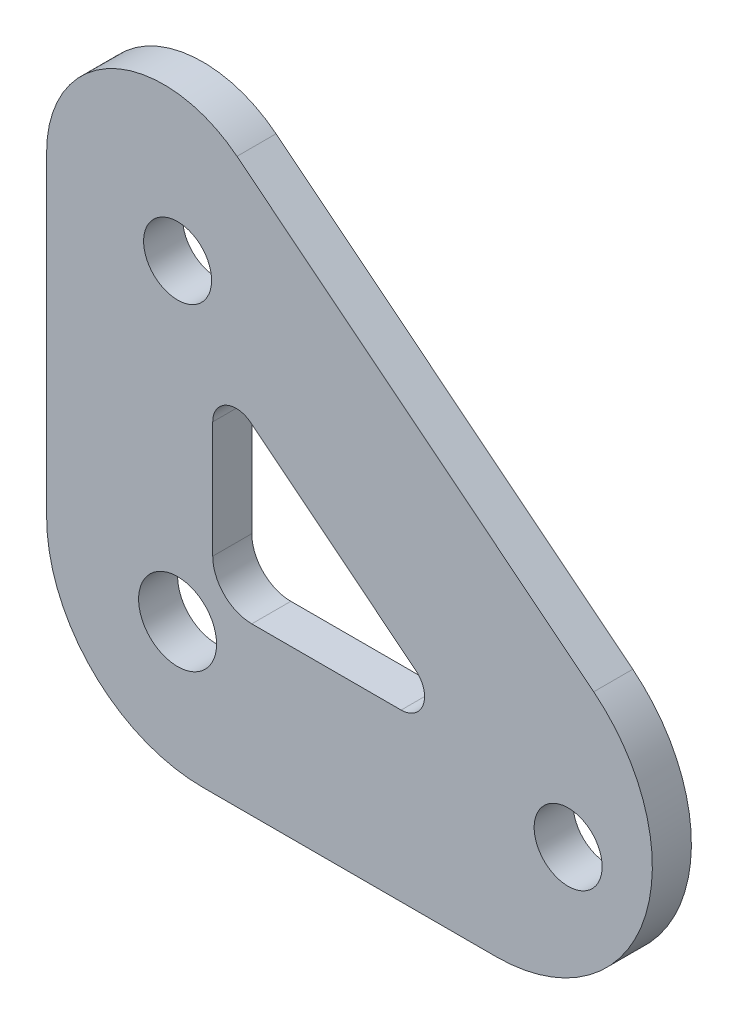
ISO-10303-21;
HEADER;
FILE_DESCRIPTION(('STEP AP214'),'2;1');
FILE_NAME('part.step','',(''),(''),'','','');
FILE_SCHEMA(('AUTOMOTIVE_DESIGN { 1 0 10303 214 1 1 1 1 }'));
ENDSEC;
DATA;
#1=APPLICATION_CONTEXT('core data for automotive mechanical design processes');
#2=APPLICATION_PROTOCOL_DEFINITION('international standard','automotive_design',2000,#1);
#3=PRODUCT_CONTEXT('',#1,'mechanical');
#4=PRODUCT('Part','Part','',(#3));
#5=PRODUCT_RELATED_PRODUCT_CATEGORY('part','',(#4));
#6=PRODUCT_DEFINITION_FORMATION('','',#4);
#7=PRODUCT_DEFINITION_CONTEXT('part definition',#1,'design');
#8=PRODUCT_DEFINITION('design','',#6,#7);
#9=PRODUCT_DEFINITION_SHAPE('','',#8);
#10=(LENGTH_UNIT() NAMED_UNIT(*) SI_UNIT(.MILLI.,.METRE.));
#11=(NAMED_UNIT(*) PLANE_ANGLE_UNIT() SI_UNIT($,.RADIAN.));
#12=(NAMED_UNIT(*) SI_UNIT($,.STERADIAN.) SOLID_ANGLE_UNIT());
#13=UNCERTAINTY_MEASURE_WITH_UNIT(LENGTH_MEASURE(1.E-05),#10,'distance_accuracy_value','');
#14=(GEOMETRIC_REPRESENTATION_CONTEXT(3) GLOBAL_UNCERTAINTY_ASSIGNED_CONTEXT((#13)) GLOBAL_UNIT_ASSIGNED_CONTEXT((#10,
#11,#12)) REPRESENTATION_CONTEXT('',''));
#15=CARTESIAN_POINT('',(0.,0.,0.));
#16=DIRECTION('',(0.,0.,1.));
#17=DIRECTION('',(1.,0.,0.));
#18=AXIS2_PLACEMENT_3D('',#15,#16,#17);
#19=CARTESIAN_POINT('',(0.,0.,5.));
#20=DIRECTION('',(0.,0.,1.));
#21=DIRECTION('',(1.,0.,0.));
#22=AXIS2_PLACEMENT_3D('',#19,#20,#21);
#23=PLANE('',#22);
#24=DIRECTION('',(0.,-1.,0.));
#25=VECTOR('',#24,1.);
#26=CARTESIAN_POINT('',(21.2655783606142,21.2655783606142,5.));
#27=LINE('',#26,#25);
#28=CARTESIAN_POINT('',(21.2655783606142,41.160892004465,5.));
#29=VERTEX_POINT('',#28);
#30=CARTESIAN_POINT('',(21.2655783606142,26.2655783606142,5.));
#31=VERTEX_POINT('',#30);
#32=EDGE_CURVE('E276',#29,#31,#27,.T.);
#33=ORIENTED_EDGE('',*,*,#32,.F.);
#34=CARTESIAN_POINT('',(24.2655783606142,41.160892004465,5.));
#35=DIRECTION('',(0.,0.,1.));
#36=DIRECTION('',(1.,0.,0.));
#37=AXIS2_PLACEMENT_3D('',#34,#35,#36);
#38=CIRCLE('',#37,3.);
#39=CARTESIAN_POINT('',(26.1396635032775,43.5034984327941,5.));
#40=VERTEX_POINT('',#39);
#41=EDGE_CURVE('E223',#29,#40,#38,.F.);
#42=ORIENTED_EDGE('',*,*,#41,.T.);
#43=DIRECTION('',(-0.78086880944303,0.624695047554424,0.));
#44=VECTOR('',#43,1.);
#45=CARTESIAN_POINT('',(21.2655783606142,47.4027665469247,5.));
#46=LINE('',#45,#44);
#47=CARTESIAN_POINT('',(47.2588055580909,26.6081847889433,5.));
#48=VERTEX_POINT('',#47);
#49=EDGE_CURVE('E269',#48,#40,#46,.T.);
#50=ORIENTED_EDGE('',*,*,#49,.F.);
#51=CARTESIAN_POINT('',(45.3847204154276,24.2655783606142,5.));
#52=DIRECTION('',(0.,0.,1.));
#53=DIRECTION('',(1.,0.,0.));
#54=AXIS2_PLACEMENT_3D('',#51,#52,#53);
#55=CIRCLE('',#54,3.);
#56=CARTESIAN_POINT('',(45.3847204154276,21.2655783606142,5.));
#57=VERTEX_POINT('',#56);
#58=EDGE_CURVE('E48',#48,#57,#55,.F.);
#59=ORIENTED_EDGE('',*,*,#58,.T.);
#60=DIRECTION('',(1.,0.,0.));
#61=VECTOR('',#60,1.);
#62=CARTESIAN_POINT('',(53.9370635935023,21.2655783606142,5.));
#63=LINE('',#62,#61);
#64=CARTESIAN_POINT('',(26.2655783606142,21.2655783606142,5.));
#65=VERTEX_POINT('',#64);
#66=EDGE_CURVE('E273',#65,#57,#63,.T.);
#67=ORIENTED_EDGE('',*,*,#66,.F.);
#68=CARTESIAN_POINT('',(26.2655783606142,26.2655783606142,5.));
#69=DIRECTION('',(0.,0.,1.));
#70=DIRECTION('',(1.,0.,0.));
#71=AXIS2_PLACEMENT_3D('',#68,#69,#70);
#72=CIRCLE('',#71,5.);
#73=EDGE_CURVE('E208',#65,#31,#72,.F.);
#74=ORIENTED_EDGE('',*,*,#73,.T.);
#75=EDGE_LOOP('',(#33,#42,#50,#59,#67,#74));
#76=FACE_BOUND('',#75,.T.);
#77=CARTESIAN_POINT('',(66.7655783606142,16.7655783606142,5.));
#78=DIRECTION('',(0.,0.,1.));
#79=DIRECTION('',(1.,0.,0.));
#80=AXIS2_PLACEMENT_3D('',#77,#78,#79);
#81=CIRCLE('',#80,4.35);
#82=CARTESIAN_POINT('',(71.1155783606142,16.7655783606142,5.));
#83=VERTEX_POINT('',#82);
#84=EDGE_CURVE('E249',#83,#83,#81,.T.);
#85=ORIENTED_EDGE('',*,*,#84,.F.);
#86=EDGE_LOOP('',(#85));
#87=FACE_BOUND('',#86,.T.);
#88=DIRECTION('',(1.,0.,0.));
#89=VECTOR('',#88,1.);
#90=CARTESIAN_POINT('',(0.,0.,5.));
#91=LINE('',#90,#89);
#92=CARTESIAN_POINT('',(20.,0.,5.));
#93=VERTEX_POINT('',#92);
#94=CARTESIAN_POINT('',(57.5449504130749,0.,5.));
#95=VERTEX_POINT('',#94);
#96=EDGE_CURVE('E151',#93,#95,#91,.T.);
#97=ORIENTED_EDGE('',*,*,#96,.T.);
#98=CARTESIAN_POINT('',(57.5449504130749,20.,5.));
#99=DIRECTION('',(0.,0.,1.));
#100=DIRECTION('',(1.,0.,0.));
#101=AXIS2_PLACEMENT_3D('',#98,#99,#100);
#102=CIRCLE('',#101,20.);
#103=CARTESIAN_POINT('',(70.0388513641634,35.6173761888606,5.));
#104=VERTEX_POINT('',#103);
#105=EDGE_CURVE('E197',#95,#104,#102,.T.);
#106=ORIENTED_EDGE('',*,*,#105,.T.);
#107=DIRECTION('',(-0.78086880944303,0.624695047554425,0.));
#108=VECTOR('',#107,1.);
#109=CARTESIAN_POINT('',(114.560571600239,0.,5.));
#110=LINE('',#109,#108);
#111=CARTESIAN_POINT('',(24.3704257133163,72.1521167095383,5.));
#112=VERTEX_POINT('',#111);
#113=EDGE_CURVE('E164',#104,#112,#110,.T.);
#114=ORIENTED_EDGE('',*,*,#113,.T.);
#115=CARTESIAN_POINT('',(15.,60.4390845678928,5.));
#116=DIRECTION('',(0.,0.,1.));
#117=DIRECTION('',(1.,0.,0.));
#118=AXIS2_PLACEMENT_3D('',#115,#116,#117);
#119=CIRCLE('',#118,15.);
#120=CARTESIAN_POINT('',(0.,60.4390845678928,5.));
#121=VERTEX_POINT('',#120);
#122=EDGE_CURVE('E172',#112,#121,#119,.T.);
#123=ORIENTED_EDGE('',*,*,#122,.T.);
#124=DIRECTION('',(0.,-1.,0.));
#125=VECTOR('',#124,1.);
#126=CARTESIAN_POINT('',(0.,91.6484572801914,5.));
#127=LINE('',#126,#125);
#128=CARTESIAN_POINT('',(0.,20.,5.));
#129=VERTEX_POINT('',#128);
#130=EDGE_CURVE('E149',#121,#129,#127,.T.);
#131=ORIENTED_EDGE('',*,*,#130,.T.);
#132=CARTESIAN_POINT('',(20.,20.,5.));
#133=DIRECTION('',(0.,0.,1.));
#134=DIRECTION('',(1.,0.,0.));
#135=AXIS2_PLACEMENT_3D('',#132,#133,#134);
#136=CIRCLE('',#135,20.);
#137=EDGE_CURVE('E184',#129,#93,#136,.T.);
#138=ORIENTED_EDGE('',*,*,#137,.T.);
#139=EDGE_LOOP('',(#97,#106,#114,#123,#131,#138));
#140=FACE_BOUND('',#139,.T.);
#141=CARTESIAN_POINT('',(16.7655783606142,56.7655783606142,5.));
#142=DIRECTION('',(0.,0.,1.));
#143=DIRECTION('',(1.,0.,0.));
#144=AXIS2_PLACEMENT_3D('',#141,#142,#143);
#145=CIRCLE('',#144,4.35);
#146=CARTESIAN_POINT('',(21.1155783606142,56.7655783606142,5.));
#147=VERTEX_POINT('',#146);
#148=EDGE_CURVE('E166',#147,#147,#145,.T.);
#149=ORIENTED_EDGE('',*,*,#148,.F.);
#150=EDGE_LOOP('',(#149));
#151=FACE_BOUND('',#150,.T.);
#152=CARTESIAN_POINT('',(16.7655783606142,16.7655783606142,5.));
#153=DIRECTION('',(0.,0.,1.));
#154=DIRECTION('',(1.,0.,0.));
#155=AXIS2_PLACEMENT_3D('',#152,#153,#154);
#156=CIRCLE('',#155,4.99);
#157=CARTESIAN_POINT('',(21.7555783606142,16.7655783606142,5.));
#158=VERTEX_POINT('',#157);
#159=EDGE_CURVE('E257',#158,#158,#156,.T.);
#160=ORIENTED_EDGE('',*,*,#159,.F.);
#161=EDGE_LOOP('',(#160));
#162=FACE_BOUND('',#161,.T.);
#163=ADVANCED_FACE('F39',(#76,#87,#140,#151,#162),#23,.T.);
#164=CARTESIAN_POINT('',(0.,0.,0.));
#165=DIRECTION('',(0.,0.,1.));
#166=DIRECTION('',(1.,0.,0.));
#167=AXIS2_PLACEMENT_3D('',#164,#165,#166);
#168=PLANE('',#167);
#169=DIRECTION('',(1.,0.,0.));
#170=VECTOR('',#169,1.);
#171=CARTESIAN_POINT('',(53.9370635935023,21.2655783606142,0.));
#172=LINE('',#171,#170);
#173=CARTESIAN_POINT('',(26.2655783606142,21.2655783606142,0.));
#174=VERTEX_POINT('',#173);
#175=CARTESIAN_POINT('',(45.3847204154276,21.2655783606142,0.));
#176=VERTEX_POINT('',#175);
#177=EDGE_CURVE('E281',#174,#176,#172,.T.);
#178=ORIENTED_EDGE('',*,*,#177,.T.);
#179=CARTESIAN_POINT('',(45.3847204154276,24.2655783606142,0.));
#180=DIRECTION('',(0.,0.,1.));
#181=DIRECTION('',(1.,0.,0.));
#182=AXIS2_PLACEMENT_3D('',#179,#180,#181);
#183=CIRCLE('',#182,3.);
#184=CARTESIAN_POINT('',(47.2588055580909,26.6081847889433,0.));
#185=VERTEX_POINT('',#184);
#186=EDGE_CURVE('E11',#176,#185,#183,.T.);
#187=ORIENTED_EDGE('',*,*,#186,.T.);
#188=DIRECTION('',(-0.78086880944303,0.624695047554424,0.));
#189=VECTOR('',#188,1.);
#190=CARTESIAN_POINT('',(21.2655783606142,47.4027665469247,0.));
#191=LINE('',#190,#189);
#192=CARTESIAN_POINT('',(26.1396635032775,43.5034984327941,0.));
#193=VERTEX_POINT('',#192);
#194=EDGE_CURVE('E265',#185,#193,#191,.T.);
#195=ORIENTED_EDGE('',*,*,#194,.T.);
#196=CARTESIAN_POINT('',(24.2655783606142,41.160892004465,0.));
#197=DIRECTION('',(0.,0.,1.));
#198=DIRECTION('',(1.,0.,0.));
#199=AXIS2_PLACEMENT_3D('',#196,#197,#198);
#200=CIRCLE('',#199,3.);
#201=CARTESIAN_POINT('',(21.2655783606142,41.160892004465,0.));
#202=VERTEX_POINT('',#201);
#203=EDGE_CURVE('E227',#193,#202,#200,.T.);
#204=ORIENTED_EDGE('',*,*,#203,.T.);
#205=DIRECTION('',(0.,-1.,0.));
#206=VECTOR('',#205,1.);
#207=CARTESIAN_POINT('',(21.2655783606142,21.2655783606142,0.));
#208=LINE('',#207,#206);
#209=CARTESIAN_POINT('',(21.2655783606142,26.2655783606142,0.));
#210=VERTEX_POINT('',#209);
#211=EDGE_CURVE('E272',#202,#210,#208,.T.);
#212=ORIENTED_EDGE('',*,*,#211,.T.);
#213=CARTESIAN_POINT('',(26.2655783606142,26.2655783606142,0.));
#214=DIRECTION('',(0.,0.,1.));
#215=DIRECTION('',(1.,0.,0.));
#216=AXIS2_PLACEMENT_3D('',#213,#214,#215);
#217=CIRCLE('',#216,5.);
#218=EDGE_CURVE('E212',#210,#174,#217,.T.);
#219=ORIENTED_EDGE('',*,*,#218,.T.);
#220=EDGE_LOOP('',(#178,#187,#195,#204,#212,#219));
#221=FACE_BOUND('',#220,.T.);
#222=DIRECTION('',(-0.78086880944303,0.624695047554425,0.));
#223=VECTOR('',#222,1.);
#224=CARTESIAN_POINT('',(114.560571600239,0.,0.));
#225=LINE('',#224,#223);
#226=CARTESIAN_POINT('',(70.0388513641634,35.6173761888606,0.));
#227=VERTEX_POINT('',#226);
#228=CARTESIAN_POINT('',(24.3704257133163,72.1521167095383,0.));
#229=VERTEX_POINT('',#228);
#230=EDGE_CURVE('E159',#227,#229,#225,.T.);
#231=ORIENTED_EDGE('',*,*,#230,.F.);
#232=CARTESIAN_POINT('',(57.5449504130749,20.,0.));
#233=DIRECTION('',(0.,0.,1.));
#234=DIRECTION('',(1.,0.,0.));
#235=AXIS2_PLACEMENT_3D('',#232,#233,#234);
#236=CIRCLE('',#235,20.);
#237=CARTESIAN_POINT('',(57.5449504130749,0.,0.));
#238=VERTEX_POINT('',#237);
#239=EDGE_CURVE('E191',#227,#238,#236,.F.);
#240=ORIENTED_EDGE('',*,*,#239,.T.);
#241=DIRECTION('',(1.,0.,0.));
#242=VECTOR('',#241,1.);
#243=CARTESIAN_POINT('',(0.,0.,0.));
#244=LINE('',#243,#242);
#245=CARTESIAN_POINT('',(20.,0.,0.));
#246=VERTEX_POINT('',#245);
#247=EDGE_CURVE('E158',#246,#238,#244,.T.);
#248=ORIENTED_EDGE('',*,*,#247,.F.);
#249=CARTESIAN_POINT('',(20.,20.,0.));
#250=DIRECTION('',(0.,0.,1.));
#251=DIRECTION('',(1.,0.,0.));
#252=AXIS2_PLACEMENT_3D('',#249,#250,#251);
#253=CIRCLE('',#252,20.);
#254=CARTESIAN_POINT('',(0.,20.,0.));
#255=VERTEX_POINT('',#254);
#256=EDGE_CURVE('E156',#246,#255,#253,.F.);
#257=ORIENTED_EDGE('',*,*,#256,.T.);
#258=DIRECTION('',(0.,-1.,0.));
#259=VECTOR('',#258,1.);
#260=CARTESIAN_POINT('',(0.,91.6484572801914,0.));
#261=LINE('',#260,#259);
#262=CARTESIAN_POINT('',(0.,60.4390845678928,0.));
#263=VERTEX_POINT('',#262);
#264=EDGE_CURVE('E146',#263,#255,#261,.T.);
#265=ORIENTED_EDGE('',*,*,#264,.F.);
#266=CARTESIAN_POINT('',(15.,60.4390845678928,0.));
#267=DIRECTION('',(0.,0.,1.));
#268=DIRECTION('',(1.,0.,0.));
#269=AXIS2_PLACEMENT_3D('',#266,#267,#268);
#270=CIRCLE('',#269,15.);
#271=EDGE_CURVE('E130',#263,#229,#270,.F.);
#272=ORIENTED_EDGE('',*,*,#271,.T.);
#273=EDGE_LOOP('',(#231,#240,#248,#257,#265,#272));
#274=FACE_BOUND('',#273,.T.);
#275=CARTESIAN_POINT('',(16.7655783606142,56.7655783606142,0.));
#276=DIRECTION('',(0.,0.,1.));
#277=DIRECTION('',(1.,0.,0.));
#278=AXIS2_PLACEMENT_3D('',#275,#276,#277);
#279=CIRCLE('',#278,4.35);
#280=CARTESIAN_POINT('',(21.1155783606142,56.7655783606142,0.));
#281=VERTEX_POINT('',#280);
#282=EDGE_CURVE('E245',#281,#281,#279,.T.);
#283=ORIENTED_EDGE('',*,*,#282,.T.);
#284=EDGE_LOOP('',(#283));
#285=FACE_BOUND('',#284,.T.);
#286=CARTESIAN_POINT('',(66.7655783606142,16.7655783606142,0.));
#287=DIRECTION('',(0.,0.,1.));
#288=DIRECTION('',(1.,0.,0.));
#289=AXIS2_PLACEMENT_3D('',#286,#287,#288);
#290=CIRCLE('',#289,4.35);
#291=CARTESIAN_POINT('',(71.1155783606142,16.7655783606142,0.));
#292=VERTEX_POINT('',#291);
#293=EDGE_CURVE('E253',#292,#292,#290,.T.);
#294=ORIENTED_EDGE('',*,*,#293,.T.);
#295=EDGE_LOOP('',(#294));
#296=FACE_BOUND('',#295,.T.);
#297=CARTESIAN_POINT('',(16.7655783606142,16.7655783606142,0.));
#298=DIRECTION('',(0.,0.,1.));
#299=DIRECTION('',(1.,0.,0.));
#300=AXIS2_PLACEMENT_3D('',#297,#298,#299);
#301=CIRCLE('',#300,4.99);
#302=CARTESIAN_POINT('',(21.7555783606142,16.7655783606142,0.));
#303=VERTEX_POINT('',#302);
#304=EDGE_CURVE('E261',#303,#303,#301,.T.);
#305=ORIENTED_EDGE('',*,*,#304,.T.);
#306=EDGE_LOOP('',(#305));
#307=FACE_BOUND('',#306,.T.);
#308=ADVANCED_FACE('F153',(#221,#274,#285,#296,#307),#168,.F.);
#309=CARTESIAN_POINT('',(114.560571600239,0.,5.));
#310=DIRECTION('',(-0.624695047554424,-0.78086880944303,0.));
#311=DIRECTION('',(0.78086880944303,-0.624695047554424,0.));
#312=AXIS2_PLACEMENT_3D('',#309,#310,#311);
#313=PLANE('',#312);
#314=ORIENTED_EDGE('',*,*,#113,.F.);
#315=DIRECTION('',(0.,0.,-1.));
#316=VECTOR('',#315,1.);
#317=CARTESIAN_POINT('',(70.0388513641634,35.6173761888606,5.));
#318=LINE('',#317,#316);
#319=EDGE_CURVE('E187',#104,#227,#318,.T.);
#320=ORIENTED_EDGE('',*,*,#319,.T.);
#321=ORIENTED_EDGE('',*,*,#230,.T.);
#322=DIRECTION('',(0.,0.,-1.));
#323=VECTOR('',#322,1.);
#324=CARTESIAN_POINT('',(24.3704257133164,72.1521167095383,5.));
#325=LINE('',#324,#323);
#326=EDGE_CURVE('E136',#229,#112,#325,.F.);
#327=ORIENTED_EDGE('',*,*,#326,.T.);
#328=EDGE_LOOP('',(#314,#320,#321,#327));
#329=FACE_BOUND('',#328,.T.);
#330=ADVANCED_FACE('F317',(#329),#313,.F.);
#331=CARTESIAN_POINT('',(0.,91.6484572801914,5.));
#332=DIRECTION('',(1.,0.,0.));
#333=DIRECTION('',(0.,1.,0.));
#334=AXIS2_PLACEMENT_3D('',#331,#332,#333);
#335=PLANE('',#334);
#336=ORIENTED_EDGE('',*,*,#264,.T.);
#337=DIRECTION('',(0.,0.,-1.));
#338=VECTOR('',#337,1.);
#339=CARTESIAN_POINT('',(0.,20.,5.));
#340=LINE('',#339,#338);
#341=EDGE_CURVE('E181',#255,#129,#340,.F.);
#342=ORIENTED_EDGE('',*,*,#341,.T.);
#343=ORIENTED_EDGE('',*,*,#130,.F.);
#344=DIRECTION('',(0.,0.,-1.));
#345=VECTOR('',#344,1.);
#346=CARTESIAN_POINT('',(0.,60.4390845678928,5.));
#347=LINE('',#346,#345);
#348=EDGE_CURVE('E134',#121,#263,#347,.T.);
#349=ORIENTED_EDGE('',*,*,#348,.T.);
#350=EDGE_LOOP('',(#336,#342,#343,#349));
#351=FACE_BOUND('',#350,.T.);
#352=ADVANCED_FACE('F145',(#351),#335,.F.);
#353=CARTESIAN_POINT('',(0.,0.,5.));
#354=DIRECTION('',(0.,1.,0.));
#355=DIRECTION('',(-1.,0.,0.));
#356=AXIS2_PLACEMENT_3D('',#353,#354,#355);
#357=PLANE('',#356);
#358=ORIENTED_EDGE('',*,*,#247,.T.);
#359=DIRECTION('',(0.,0.,-1.));
#360=VECTOR('',#359,1.);
#361=CARTESIAN_POINT('',(57.5449504130749,0.,5.));
#362=LINE('',#361,#360);
#363=EDGE_CURVE('E194',#238,#95,#362,.F.);
#364=ORIENTED_EDGE('',*,*,#363,.T.);
#365=ORIENTED_EDGE('',*,*,#96,.F.);
#366=DIRECTION('',(0.,0.,-1.));
#367=VECTOR('',#366,1.);
#368=CARTESIAN_POINT('',(20.,0.,5.));
#369=LINE('',#368,#367);
#370=EDGE_CURVE('E175',#93,#246,#369,.T.);
#371=ORIENTED_EDGE('',*,*,#370,.T.);
#372=EDGE_LOOP('',(#358,#364,#365,#371));
#373=FACE_BOUND('',#372,.T.);
#374=ADVANCED_FACE('F323',(#373),#357,.F.);
#375=CARTESIAN_POINT('',(16.7655783606142,56.7655783606142,5.));
#376=DIRECTION('',(0.,0.,-1.));
#377=DIRECTION('',(-1.,0.,0.));
#378=AXIS2_PLACEMENT_3D('',#375,#376,#377);
#379=CYLINDRICAL_SURFACE('',#378,4.35);
#380=ORIENTED_EDGE('',*,*,#148,.T.);
#381=EDGE_LOOP('',(#380));
#382=FACE_BOUND('',#381,.T.);
#383=ORIENTED_EDGE('',*,*,#282,.F.);
#384=EDGE_LOOP('',(#383));
#385=FACE_BOUND('',#384,.T.);
#386=ADVANCED_FACE('F320',(#382,#385),#379,.F.);
#387=CARTESIAN_POINT('',(66.7655783606142,16.7655783606142,5.));
#388=DIRECTION('',(0.,0.,-1.));
#389=DIRECTION('',(-1.,0.,0.));
#390=AXIS2_PLACEMENT_3D('',#387,#388,#389);
#391=CYLINDRICAL_SURFACE('',#390,4.35);
#392=ORIENTED_EDGE('',*,*,#84,.T.);
#393=EDGE_LOOP('',(#392));
#394=FACE_BOUND('',#393,.T.);
#395=ORIENTED_EDGE('',*,*,#293,.F.);
#396=EDGE_LOOP('',(#395));
#397=FACE_BOUND('',#396,.T.);
#398=ADVANCED_FACE('F356',(#394,#397),#391,.F.);
#399=CARTESIAN_POINT('',(16.7655783606142,16.7655783606142,5.));
#400=DIRECTION('',(0.,0.,-1.));
#401=DIRECTION('',(-1.,0.,0.));
#402=AXIS2_PLACEMENT_3D('',#399,#400,#401);
#403=CYLINDRICAL_SURFACE('',#402,4.99);
#404=ORIENTED_EDGE('',*,*,#159,.T.);
#405=EDGE_LOOP('',(#404));
#406=FACE_BOUND('',#405,.T.);
#407=ORIENTED_EDGE('',*,*,#304,.F.);
#408=EDGE_LOOP('',(#407));
#409=FACE_BOUND('',#408,.T.);
#410=ADVANCED_FACE('F335',(#406,#409),#403,.F.);
#411=CARTESIAN_POINT('',(15.,60.4390845678928,5.));
#412=DIRECTION('',(0.,0.,-1.));
#413=DIRECTION('',(-1.,0.,0.));
#414=AXIS2_PLACEMENT_3D('',#411,#412,#413);
#415=CYLINDRICAL_SURFACE('',#414,15.);
#416=ORIENTED_EDGE('',*,*,#122,.F.);
#417=ORIENTED_EDGE('',*,*,#326,.F.);
#418=ORIENTED_EDGE('',*,*,#271,.F.);
#419=ORIENTED_EDGE('',*,*,#348,.F.);
#420=EDGE_LOOP('',(#416,#417,#418,#419));
#421=FACE_BOUND('',#420,.T.);
#422=ADVANCED_FACE('F133',(#421),#415,.T.);
#423=CARTESIAN_POINT('',(20.,20.,5.));
#424=DIRECTION('',(0.,0.,-1.));
#425=DIRECTION('',(-1.,0.,0.));
#426=AXIS2_PLACEMENT_3D('',#423,#424,#425);
#427=CYLINDRICAL_SURFACE('',#426,20.);
#428=ORIENTED_EDGE('',*,*,#137,.F.);
#429=ORIENTED_EDGE('',*,*,#341,.F.);
#430=ORIENTED_EDGE('',*,*,#256,.F.);
#431=ORIENTED_EDGE('',*,*,#370,.F.);
#432=EDGE_LOOP('',(#428,#429,#430,#431));
#433=FACE_BOUND('',#432,.T.);
#434=ADVANCED_FACE('F334',(#433),#427,.T.);
#435=CARTESIAN_POINT('',(57.5449504130749,20.,5.));
#436=DIRECTION('',(0.,0.,-1.));
#437=DIRECTION('',(-1.,0.,0.));
#438=AXIS2_PLACEMENT_3D('',#435,#436,#437);
#439=CYLINDRICAL_SURFACE('',#438,20.);
#440=ORIENTED_EDGE('',*,*,#105,.F.);
#441=ORIENTED_EDGE('',*,*,#363,.F.);
#442=ORIENTED_EDGE('',*,*,#239,.F.);
#443=ORIENTED_EDGE('',*,*,#319,.F.);
#444=EDGE_LOOP('',(#440,#441,#442,#443));
#445=FACE_BOUND('',#444,.T.);
#446=ADVANCED_FACE('F338',(#445),#439,.T.);
#447=CARTESIAN_POINT('',(21.2655783606142,21.2655783606142,0.));
#448=DIRECTION('',(-1.,0.,0.));
#449=DIRECTION('',(0.,0.,1.));
#450=AXIS2_PLACEMENT_3D('',#447,#448,#449);
#451=PLANE('',#450);
#452=ORIENTED_EDGE('',*,*,#211,.F.);
#453=DIRECTION('',(0.,0.,1.));
#454=VECTOR('',#453,1.);
#455=CARTESIAN_POINT('',(21.2655783606142,41.160892004465,5.));
#456=LINE('',#455,#454);
#457=EDGE_CURVE('E215',#202,#29,#456,.T.);
#458=ORIENTED_EDGE('',*,*,#457,.T.);
#459=ORIENTED_EDGE('',*,*,#32,.T.);
#460=DIRECTION('',(0.,0.,1.));
#461=VECTOR('',#460,1.);
#462=CARTESIAN_POINT('',(21.2655783606142,26.2655783606142,0.));
#463=LINE('',#462,#461);
#464=EDGE_CURVE('E204',#31,#210,#463,.F.);
#465=ORIENTED_EDGE('',*,*,#464,.T.);
#466=EDGE_LOOP('',(#452,#458,#459,#465));
#467=FACE_BOUND('',#466,.T.);
#468=ADVANCED_FACE('F292',(#467),#451,.F.);
#469=CARTESIAN_POINT('',(21.2655783606142,47.4027665469247,0.));
#470=DIRECTION('',(0.624695047554424,0.78086880944303,0.));
#471=DIRECTION('',(-0.78086880944303,0.624695047554424,0.));
#472=AXIS2_PLACEMENT_3D('',#469,#470,#471);
#473=PLANE('',#472);
#474=ORIENTED_EDGE('',*,*,#194,.F.);
#475=DIRECTION('',(0.,0.,1.));
#476=VECTOR('',#475,1.);
#477=CARTESIAN_POINT('',(47.2588055580909,26.6081847889433,5.));
#478=LINE('',#477,#476);
#479=EDGE_CURVE('E230',#185,#48,#478,.T.);
#480=ORIENTED_EDGE('',*,*,#479,.T.);
#481=ORIENTED_EDGE('',*,*,#49,.T.);
#482=DIRECTION('',(0.,0.,1.));
#483=VECTOR('',#482,1.);
#484=CARTESIAN_POINT('',(26.1396635032775,43.5034984327941,0.));
#485=LINE('',#484,#483);
#486=EDGE_CURVE('E219',#40,#193,#485,.F.);
#487=ORIENTED_EDGE('',*,*,#486,.T.);
#488=EDGE_LOOP('',(#474,#480,#481,#487));
#489=FACE_BOUND('',#488,.T.);
#490=ADVANCED_FACE('F304',(#489),#473,.F.);
#491=CARTESIAN_POINT('',(53.9370635935023,21.2655783606142,0.));
#492=DIRECTION('',(0.,-1.,0.));
#493=DIRECTION('',(1.,0.,0.));
#494=AXIS2_PLACEMENT_3D('',#491,#492,#493);
#495=PLANE('',#494);
#496=ORIENTED_EDGE('',*,*,#66,.T.);
#497=DIRECTION('',(0.,0.,1.));
#498=VECTOR('',#497,1.);
#499=CARTESIAN_POINT('',(45.3847204154276,21.2655783606142,0.));
#500=LINE('',#499,#498);
#501=EDGE_CURVE('E61',#57,#176,#500,.F.);
#502=ORIENTED_EDGE('',*,*,#501,.T.);
#503=ORIENTED_EDGE('',*,*,#177,.F.);
#504=DIRECTION('',(0.,0.,1.));
#505=VECTOR('',#504,1.);
#506=CARTESIAN_POINT('',(26.2655783606142,21.2655783606142,5.));
#507=LINE('',#506,#505);
#508=EDGE_CURVE('E200',#174,#65,#507,.T.);
#509=ORIENTED_EDGE('',*,*,#508,.T.);
#510=EDGE_LOOP('',(#496,#502,#503,#509));
#511=FACE_BOUND('',#510,.T.);
#512=ADVANCED_FACE('F297',(#511),#495,.F.);
#513=CARTESIAN_POINT('',(26.2655783606142,26.2655783606142,0.));
#514=DIRECTION('',(0.,0.,-1.));
#515=DIRECTION('',(-1.,0.,0.));
#516=AXIS2_PLACEMENT_3D('',#513,#514,#515);
#517=CYLINDRICAL_SURFACE('',#516,5.);
#518=ORIENTED_EDGE('',*,*,#218,.F.);
#519=ORIENTED_EDGE('',*,*,#464,.F.);
#520=ORIENTED_EDGE('',*,*,#73,.F.);
#521=ORIENTED_EDGE('',*,*,#508,.F.);
#522=EDGE_LOOP('',(#518,#519,#520,#521));
#523=FACE_BOUND('',#522,.T.);
#524=ADVANCED_FACE('F296',(#523),#517,.F.);
#525=CARTESIAN_POINT('',(24.2655783606142,41.160892004465,0.));
#526=DIRECTION('',(0.,0.,-1.));
#527=DIRECTION('',(-1.,0.,0.));
#528=AXIS2_PLACEMENT_3D('',#525,#526,#527);
#529=CYLINDRICAL_SURFACE('',#528,3.);
#530=ORIENTED_EDGE('',*,*,#203,.F.);
#531=ORIENTED_EDGE('',*,*,#486,.F.);
#532=ORIENTED_EDGE('',*,*,#41,.F.);
#533=ORIENTED_EDGE('',*,*,#457,.F.);
#534=EDGE_LOOP('',(#530,#531,#532,#533));
#535=FACE_BOUND('',#534,.T.);
#536=ADVANCED_FACE('F301',(#535),#529,.F.);
#537=CARTESIAN_POINT('',(45.3847204154276,24.2655783606142,0.));
#538=DIRECTION('',(0.,0.,-1.));
#539=DIRECTION('',(-1.,0.,0.));
#540=AXIS2_PLACEMENT_3D('',#537,#538,#539);
#541=CYLINDRICAL_SURFACE('',#540,3.);
#542=ORIENTED_EDGE('',*,*,#186,.F.);
#543=ORIENTED_EDGE('',*,*,#501,.F.);
#544=ORIENTED_EDGE('',*,*,#58,.F.);
#545=ORIENTED_EDGE('',*,*,#479,.F.);
#546=EDGE_LOOP('',(#542,#543,#544,#545));
#547=FACE_BOUND('',#546,.T.);
#548=ADVANCED_FACE('F41',(#547),#541,.F.);
#549=CLOSED_SHELL('',(#163,#308,#330,#352,#374,#386,#398,#410,#422,#434,#446,#468,#490,#512,
#524,#536,#548));
#550=MANIFOLD_SOLID_BREP('B2',#549);
#551=ADVANCED_BREP_SHAPE_REPRESENTATION('',(#18,#550),#14);
#552=SHAPE_DEFINITION_REPRESENTATION(#9,#551);
ENDSEC;
END-ISO-10303-21;
